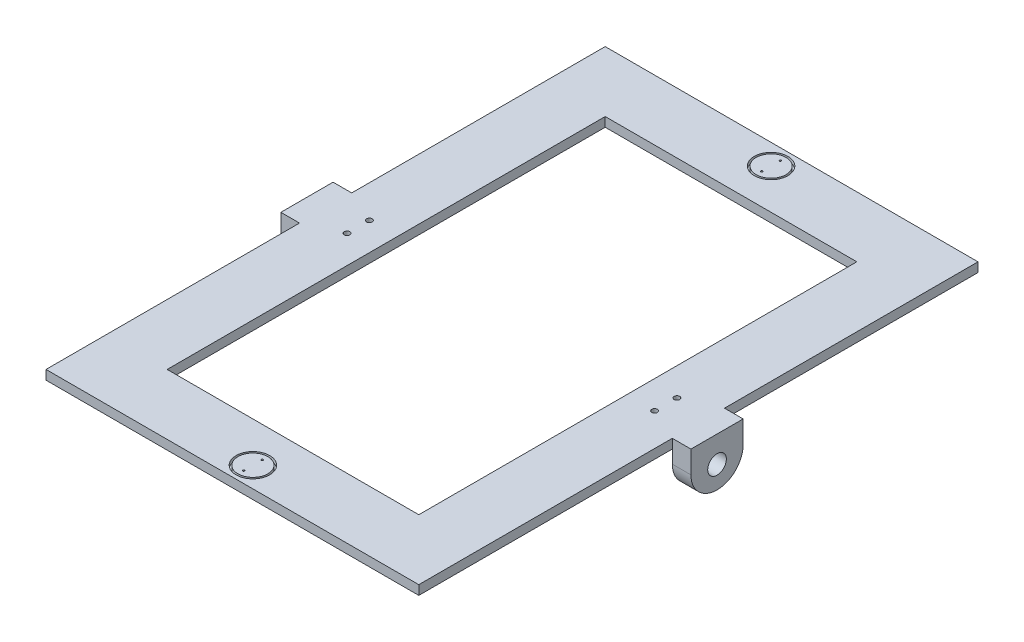
ISO-10303-21;
HEADER;
FILE_DESCRIPTION(('STEP AP214'),'2;1');
FILE_NAME('part.step','',(''),(''),'','','');
FILE_SCHEMA(('AUTOMOTIVE_DESIGN { 1 0 10303 214 1 1 1 1 }'));
ENDSEC;
DATA;
#1=APPLICATION_CONTEXT('core data for automotive mechanical design processes');
#2=APPLICATION_PROTOCOL_DEFINITION('international standard','automotive_design',2000,#1);
#3=PRODUCT_CONTEXT('',#1,'mechanical');
#4=PRODUCT('Part','Part','',(#3));
#5=PRODUCT_RELATED_PRODUCT_CATEGORY('part','',(#4));
#6=PRODUCT_DEFINITION_FORMATION('','',#4);
#7=PRODUCT_DEFINITION_CONTEXT('part definition',#1,'design');
#8=PRODUCT_DEFINITION('design','',#6,#7);
#9=PRODUCT_DEFINITION_SHAPE('','',#8);
#10=(LENGTH_UNIT() NAMED_UNIT(*) SI_UNIT(.MILLI.,.METRE.));
#11=(NAMED_UNIT(*) PLANE_ANGLE_UNIT() SI_UNIT($,.RADIAN.));
#12=(NAMED_UNIT(*) SI_UNIT($,.STERADIAN.) SOLID_ANGLE_UNIT());
#13=UNCERTAINTY_MEASURE_WITH_UNIT(LENGTH_MEASURE(1.E-05),#10,'distance_accuracy_value','');
#14=(GEOMETRIC_REPRESENTATION_CONTEXT(3) GLOBAL_UNCERTAINTY_ASSIGNED_CONTEXT((#13)) GLOBAL_UNIT_ASSIGNED_CONTEXT((#10,
#11,#12)) REPRESENTATION_CONTEXT('',''));
#15=CARTESIAN_POINT('',(0.,0.,0.));
#16=DIRECTION('',(0.,0.,1.));
#17=DIRECTION('',(1.,0.,0.));
#18=AXIS2_PLACEMENT_3D('',#15,#16,#17);
#19=CARTESIAN_POINT('',(-100.,5.,-150.));
#20=DIRECTION('',(1.,0.,0.));
#21=DIRECTION('',(0.,0.,-1.));
#22=AXIS2_PLACEMENT_3D('',#19,#20,#21);
#23=PLANE('',#22);
#24=DIRECTION('',(0.,0.,1.));
#25=VECTOR('',#24,1.);
#26=CARTESIAN_POINT('',(-100.,5.,-150.));
#27=LINE('',#26,#25);
#28=CARTESIAN_POINT('',(-100.,5.,14.));
#29=VERTEX_POINT('',#28);
#30=CARTESIAN_POINT('',(-100.,5.,150.));
#31=VERTEX_POINT('',#30);
#32=EDGE_CURVE('E319',#29,#31,#27,.T.);
#33=ORIENTED_EDGE('',*,*,#32,.F.);
#34=DIRECTION('',(0.,-1.,0.));
#35=VECTOR('',#34,1.);
#36=CARTESIAN_POINT('',(-100.,5.,14.));
#37=LINE('',#36,#35);
#38=CARTESIAN_POINT('',(-100.,0.,14.));
#39=VERTEX_POINT('',#38);
#40=EDGE_CURVE('E177',#29,#39,#37,.T.);
#41=ORIENTED_EDGE('',*,*,#40,.T.);
#42=DIRECTION('',(0.,0.,1.));
#43=VECTOR('',#42,1.);
#44=CARTESIAN_POINT('',(-100.,0.,-150.));
#45=LINE('',#44,#43);
#46=CARTESIAN_POINT('',(-100.,0.,150.));
#47=VERTEX_POINT('',#46);
#48=EDGE_CURVE('E334',#39,#47,#45,.T.);
#49=ORIENTED_EDGE('',*,*,#48,.T.);
#50=DIRECTION('',(0.,-1.,0.));
#51=VECTOR('',#50,1.);
#52=CARTESIAN_POINT('',(-100.,5.,150.));
#53=LINE('',#52,#51);
#54=EDGE_CURVE('E346',#31,#47,#53,.T.);
#55=ORIENTED_EDGE('',*,*,#54,.F.);
#56=EDGE_LOOP('',(#33,#41,#49,#55));
#57=FACE_BOUND('',#56,.T.);
#58=ADVANCED_FACE('F39',(#57),#23,.F.);
#59=CARTESIAN_POINT('',(100.,5.,-150.));
#60=DIRECTION('',(-1.,0.,0.));
#61=DIRECTION('',(0.,0.,1.));
#62=AXIS2_PLACEMENT_3D('',#59,#60,#61);
#63=PLANE('',#62);
#64=DIRECTION('',(0.,-1.,0.));
#65=VECTOR('',#64,1.);
#66=CARTESIAN_POINT('',(100.,5.,14.));
#67=LINE('',#66,#65);
#68=CARTESIAN_POINT('',(100.,5.,14.));
#69=VERTEX_POINT('',#68);
#70=CARTESIAN_POINT('',(100.,0.,14.));
#71=VERTEX_POINT('',#70);
#72=EDGE_CURVE('E65',#69,#71,#67,.T.);
#73=ORIENTED_EDGE('',*,*,#72,.F.);
#74=DIRECTION('',(0.,0.,-1.));
#75=VECTOR('',#74,1.);
#76=CARTESIAN_POINT('',(100.,5.,-150.));
#77=LINE('',#76,#75);
#78=CARTESIAN_POINT('',(100.,5.,150.));
#79=VERTEX_POINT('',#78);
#80=EDGE_CURVE('E312',#79,#69,#77,.T.);
#81=ORIENTED_EDGE('',*,*,#80,.F.);
#82=DIRECTION('',(0.,-1.,0.));
#83=VECTOR('',#82,1.);
#84=CARTESIAN_POINT('',(100.,5.,150.));
#85=LINE('',#84,#83);
#86=CARTESIAN_POINT('',(100.,0.,150.));
#87=VERTEX_POINT('',#86);
#88=EDGE_CURVE('E326',#79,#87,#85,.T.);
#89=ORIENTED_EDGE('',*,*,#88,.T.);
#90=DIRECTION('',(0.,0.,-1.));
#91=VECTOR('',#90,1.);
#92=CARTESIAN_POINT('',(100.,0.,-150.));
#93=LINE('',#92,#91);
#94=EDGE_CURVE('E327',#87,#71,#93,.T.);
#95=ORIENTED_EDGE('',*,*,#94,.T.);
#96=EDGE_LOOP('',(#73,#81,#89,#95));
#97=FACE_BOUND('',#96,.T.);
#98=ADVANCED_FACE('F41',(#97),#63,.F.);
#99=DIRECTION('',(0.,1.,0.));
#100=VECTOR('',#99,1.);
#101=CARTESIAN_POINT('',(100.,5.,-14.));
#102=LINE('',#101,#100);
#103=CARTESIAN_POINT('',(100.,0.,-14.));
#104=VERTEX_POINT('',#103);
#105=CARTESIAN_POINT('',(100.,5.,-14.));
#106=VERTEX_POINT('',#105);
#107=EDGE_CURVE('E49',#104,#106,#102,.T.);
#108=ORIENTED_EDGE('',*,*,#107,.F.);
#109=CARTESIAN_POINT('',(100.,0.,-150.));
#110=VERTEX_POINT('',#109);
#111=EDGE_CURVE('E311',#104,#110,#93,.T.);
#112=ORIENTED_EDGE('',*,*,#111,.T.);
#113=DIRECTION('',(0.,-1.,0.));
#114=VECTOR('',#113,1.);
#115=CARTESIAN_POINT('',(100.,5.,-150.));
#116=LINE('',#115,#114);
#117=CARTESIAN_POINT('',(100.,5.,-150.));
#118=VERTEX_POINT('',#117);
#119=EDGE_CURVE('E43',#118,#110,#116,.T.);
#120=ORIENTED_EDGE('',*,*,#119,.F.);
#121=EDGE_CURVE('E316',#106,#118,#77,.T.);
#122=ORIENTED_EDGE('',*,*,#121,.F.);
#123=EDGE_LOOP('',(#108,#112,#120,#122));
#124=FACE_BOUND('',#123,.T.);
#125=ADVANCED_FACE('F390',(#124),#63,.F.);
#126=CARTESIAN_POINT('',(0.,5.,0.));
#127=DIRECTION('',(0.,1.,0.));
#128=DIRECTION('',(0.,0.,1.));
#129=AXIS2_PLACEMENT_3D('',#126,#127,#128);
#130=PLANE('',#129);
#131=CARTESIAN_POINT('',(82.5,5.,-6.));
#132=DIRECTION('',(0.,-1.,0.));
#133=DIRECTION('',(0.,0.,1.));
#134=AXIS2_PLACEMENT_3D('',#131,#132,#133);
#135=CIRCLE('',#134,1.49999999999995);
#136=CARTESIAN_POINT('',(82.5,5.,-4.50000000000005));
#137=VERTEX_POINT('',#136);
#138=EDGE_CURVE('E565',#137,#137,#135,.T.);
#139=ORIENTED_EDGE('',*,*,#138,.T.);
#140=EDGE_LOOP('',(#139));
#141=FACE_BOUND('',#140,.T.);
#142=CARTESIAN_POINT('',(82.5,5.,5.99999999999998));
#143=DIRECTION('',(0.,-1.,0.));
#144=DIRECTION('',(0.,0.,-1.));
#145=AXIS2_PLACEMENT_3D('',#142,#143,#144);
#146=CIRCLE('',#145,1.49999999999995);
#147=CARTESIAN_POINT('',(82.5,5.,4.50000000000003));
#148=VERTEX_POINT('',#147);
#149=EDGE_CURVE('E574',#148,#148,#146,.T.);
#150=ORIENTED_EDGE('',*,*,#149,.T.);
#151=EDGE_LOOP('',(#150));
#152=FACE_BOUND('',#151,.T.);
#153=CARTESIAN_POINT('',(-82.5,5.,-6.));
#154=DIRECTION('',(0.,1.,0.));
#155=DIRECTION('',(0.,0.,1.));
#156=AXIS2_PLACEMENT_3D('',#153,#154,#155);
#157=CIRCLE('',#156,1.49999999999995);
#158=CARTESIAN_POINT('',(-82.5,5.,-4.50000000000005));
#159=VERTEX_POINT('',#158);
#160=EDGE_CURVE('E580',#159,#159,#157,.T.);
#161=ORIENTED_EDGE('',*,*,#160,.F.);
#162=EDGE_LOOP('',(#161));
#163=FACE_BOUND('',#162,.T.);
#164=CARTESIAN_POINT('',(-82.5,5.,5.99999999999998));
#165=DIRECTION('',(0.,1.,0.));
#166=DIRECTION('',(0.,0.,-1.));
#167=AXIS2_PLACEMENT_3D('',#164,#165,#166);
#168=CIRCLE('',#167,1.49999999999995);
#169=CARTESIAN_POINT('',(-82.5,5.,4.50000000000003));
#170=VERTEX_POINT('',#169);
#171=EDGE_CURVE('E571',#170,#170,#168,.T.);
#172=ORIENTED_EDGE('',*,*,#171,.F.);
#173=EDGE_LOOP('',(#172));
#174=FACE_BOUND('',#173,.T.);
#175=CARTESIAN_POINT('',(0.,5.,-139.));
#176=DIRECTION('',(0.,-1.,0.));
#177=DIRECTION('',(0.,0.,-1.));
#178=AXIS2_PLACEMENT_3D('',#175,#176,#177);
#179=CIRCLE('',#178,9.00000000000001);
#180=CARTESIAN_POINT('',(0.,5.,-148.));
#181=VERTEX_POINT('',#180);
#182=EDGE_CURVE('E632',#181,#181,#179,.T.);
#183=ORIENTED_EDGE('',*,*,#182,.T.);
#184=EDGE_LOOP('',(#183));
#185=FACE_BOUND('',#184,.T.);
#186=CARTESIAN_POINT('',(0.,5.,139.));
#187=DIRECTION('',(0.,1.,0.));
#188=DIRECTION('',(0.,0.,1.));
#189=AXIS2_PLACEMENT_3D('',#186,#187,#188);
#190=CIRCLE('',#189,9.00000000000001);
#191=CARTESIAN_POINT('',(0.,5.,148.));
#192=VERTEX_POINT('',#191);
#193=EDGE_CURVE('E648',#192,#192,#190,.T.);
#194=ORIENTED_EDGE('',*,*,#193,.F.);
#195=EDGE_LOOP('',(#194));
#196=FACE_BOUND('',#195,.T.);
#197=ORIENTED_EDGE('',*,*,#80,.T.);
#198=DIRECTION('',(-1.,0.,0.));
#199=VECTOR('',#198,1.);
#200=CARTESIAN_POINT('',(110.,5.,14.));
#201=LINE('',#200,#199);
#202=CARTESIAN_POINT('',(110.,5.,14.));
#203=VERTEX_POINT('',#202);
#204=EDGE_CURVE('E244',#203,#69,#201,.T.);
#205=ORIENTED_EDGE('',*,*,#204,.F.);
#206=DIRECTION('',(0.,0.,1.));
#207=VECTOR('',#206,1.);
#208=CARTESIAN_POINT('',(110.,5.,14.));
#209=LINE('',#208,#207);
#210=CARTESIAN_POINT('',(110.,5.,-14.));
#211=VERTEX_POINT('',#210);
#212=EDGE_CURVE('E241',#211,#203,#209,.T.);
#213=ORIENTED_EDGE('',*,*,#212,.F.);
#214=DIRECTION('',(-1.,0.,0.));
#215=VECTOR('',#214,1.);
#216=CARTESIAN_POINT('',(110.,5.,-14.));
#217=LINE('',#216,#215);
#218=EDGE_CURVE('E256',#211,#106,#217,.T.);
#219=ORIENTED_EDGE('',*,*,#218,.T.);
#220=ORIENTED_EDGE('',*,*,#121,.T.);
#221=DIRECTION('',(-1.,0.,0.));
#222=VECTOR('',#221,1.);
#223=CARTESIAN_POINT('',(-100.,5.,-150.));
#224=LINE('',#223,#222);
#225=CARTESIAN_POINT('',(-100.,5.,-150.));
#226=VERTEX_POINT('',#225);
#227=EDGE_CURVE('E315',#118,#226,#224,.T.);
#228=ORIENTED_EDGE('',*,*,#227,.T.);
#229=CARTESIAN_POINT('',(-100.,5.,-14.));
#230=VERTEX_POINT('',#229);
#231=EDGE_CURVE('E320',#226,#230,#27,.T.);
#232=ORIENTED_EDGE('',*,*,#231,.T.);
#233=DIRECTION('',(1.,0.,0.));
#234=VECTOR('',#233,1.);
#235=CARTESIAN_POINT('',(-110.,5.,-14.));
#236=LINE('',#235,#234);
#237=CARTESIAN_POINT('',(-110.,5.,-14.));
#238=VERTEX_POINT('',#237);
#239=EDGE_CURVE('E58',#238,#230,#236,.T.);
#240=ORIENTED_EDGE('',*,*,#239,.F.);
#241=DIRECTION('',(0.,0.,1.));
#242=VECTOR('',#241,1.);
#243=CARTESIAN_POINT('',(-110.,5.,14.));
#244=LINE('',#243,#242);
#245=CARTESIAN_POINT('',(-110.,5.,14.));
#246=VERTEX_POINT('',#245);
#247=EDGE_CURVE('E188',#238,#246,#244,.T.);
#248=ORIENTED_EDGE('',*,*,#247,.T.);
#249=DIRECTION('',(1.,0.,0.));
#250=VECTOR('',#249,1.);
#251=CARTESIAN_POINT('',(-110.,5.,14.));
#252=LINE('',#251,#250);
#253=EDGE_CURVE('E169',#246,#29,#252,.T.);
#254=ORIENTED_EDGE('',*,*,#253,.T.);
#255=ORIENTED_EDGE('',*,*,#32,.T.);
#256=DIRECTION('',(1.,0.,0.));
#257=VECTOR('',#256,1.);
#258=CARTESIAN_POINT('',(-100.,5.,150.));
#259=LINE('',#258,#257);
#260=EDGE_CURVE('E323',#31,#79,#259,.T.);
#261=ORIENTED_EDGE('',*,*,#260,.T.);
#262=EDGE_LOOP('',(#197,#205,#213,#219,#220,#228,#232,#240,#248,#254,#255,#261));
#263=FACE_BOUND('',#262,.T.);
#264=DIRECTION('',(-1.,0.,0.));
#265=VECTOR('',#264,1.);
#266=CARTESIAN_POINT('',(-67.5,5.,-117.5));
#267=LINE('',#266,#265);
#268=CARTESIAN_POINT('',(67.5,5.,-117.5));
#269=VERTEX_POINT('',#268);
#270=CARTESIAN_POINT('',(-67.5,5.,-117.5));
#271=VERTEX_POINT('',#270);
#272=EDGE_CURVE('E272',#269,#271,#267,.T.);
#273=ORIENTED_EDGE('',*,*,#272,.F.);
#274=DIRECTION('',(0.,0.,-1.));
#275=VECTOR('',#274,1.);
#276=CARTESIAN_POINT('',(67.5,5.,-117.5));
#277=LINE('',#276,#275);
#278=CARTESIAN_POINT('',(67.5,5.,117.5));
#279=VERTEX_POINT('',#278);
#280=EDGE_CURVE('E269',#279,#269,#277,.T.);
#281=ORIENTED_EDGE('',*,*,#280,.F.);
#282=DIRECTION('',(1.,0.,0.));
#283=VECTOR('',#282,1.);
#284=CARTESIAN_POINT('',(-67.5,5.,117.5));
#285=LINE('',#284,#283);
#286=CARTESIAN_POINT('',(-67.5,5.,117.5));
#287=VERTEX_POINT('',#286);
#288=EDGE_CURVE('E280',#287,#279,#285,.T.);
#289=ORIENTED_EDGE('',*,*,#288,.F.);
#290=DIRECTION('',(0.,0.,1.));
#291=VECTOR('',#290,1.);
#292=CARTESIAN_POINT('',(-67.5,5.,-117.5));
#293=LINE('',#292,#291);
#294=EDGE_CURVE('E276',#271,#287,#293,.T.);
#295=ORIENTED_EDGE('',*,*,#294,.F.);
#296=EDGE_LOOP('',(#273,#281,#289,#295));
#297=FACE_BOUND('',#296,.T.);
#298=ADVANCED_FACE('F194',(#141,#152,#163,#174,#185,#196,#263,#297),#130,.T.);
#299=CARTESIAN_POINT('',(0.,0.,0.));
#300=DIRECTION('',(0.,1.,0.));
#301=DIRECTION('',(0.,0.,1.));
#302=AXIS2_PLACEMENT_3D('',#299,#300,#301);
#303=PLANE('',#302);
#304=CARTESIAN_POINT('',(82.5,0.,-6.));
#305=DIRECTION('',(0.,1.,0.));
#306=DIRECTION('',(0.,0.,1.));
#307=AXIS2_PLACEMENT_3D('',#304,#305,#306);
#308=CIRCLE('',#307,1.49999999999995);
#309=CARTESIAN_POINT('',(82.5,0.,-4.50000000000005));
#310=VERTEX_POINT('',#309);
#311=EDGE_CURVE('E562',#310,#310,#308,.T.);
#312=ORIENTED_EDGE('',*,*,#311,.T.);
#313=EDGE_LOOP('',(#312));
#314=FACE_BOUND('',#313,.T.);
#315=CARTESIAN_POINT('',(82.5,0.,5.99999999999998));
#316=DIRECTION('',(0.,1.,0.));
#317=DIRECTION('',(0.,0.,1.));
#318=AXIS2_PLACEMENT_3D('',#315,#316,#317);
#319=CIRCLE('',#318,1.49999999999995);
#320=CARTESIAN_POINT('',(82.5,0.,7.49999999999993));
#321=VERTEX_POINT('',#320);
#322=EDGE_CURVE('E567',#321,#321,#319,.T.);
#323=ORIENTED_EDGE('',*,*,#322,.T.);
#324=EDGE_LOOP('',(#323));
#325=FACE_BOUND('',#324,.T.);
#326=CARTESIAN_POINT('',(-82.5,0.,-6.));
#327=DIRECTION('',(0.,1.,0.));
#328=DIRECTION('',(0.,0.,1.));
#329=AXIS2_PLACEMENT_3D('',#326,#327,#328);
#330=CIRCLE('',#329,1.49999999999995);
#331=CARTESIAN_POINT('',(-82.5,0.,-4.50000000000005));
#332=VERTEX_POINT('',#331);
#333=EDGE_CURVE('E584',#332,#332,#330,.F.);
#334=ORIENTED_EDGE('',*,*,#333,.F.);
#335=EDGE_LOOP('',(#334));
#336=FACE_BOUND('',#335,.T.);
#337=CARTESIAN_POINT('',(-82.5,0.,5.99999999999998));
#338=DIRECTION('',(0.,1.,0.));
#339=DIRECTION('',(0.,0.,1.));
#340=AXIS2_PLACEMENT_3D('',#337,#338,#339);
#341=CIRCLE('',#340,1.49999999999995);
#342=CARTESIAN_POINT('',(-82.5,0.,7.49999999999993));
#343=VERTEX_POINT('',#342);
#344=EDGE_CURVE('E585',#343,#343,#341,.F.);
#345=ORIENTED_EDGE('',*,*,#344,.F.);
#346=EDGE_LOOP('',(#345));
#347=FACE_BOUND('',#346,.T.);
#348=CARTESIAN_POINT('',(0.,0.,-134.));
#349=DIRECTION('',(0.,1.,0.));
#350=DIRECTION('',(0.,0.,1.));
#351=AXIS2_PLACEMENT_3D('',#348,#349,#350);
#352=CIRCLE('',#351,0.5);
#353=CARTESIAN_POINT('',(0.,0.,-133.5));
#354=VERTEX_POINT('',#353);
#355=EDGE_CURVE('E600',#354,#354,#352,.T.);
#356=ORIENTED_EDGE('',*,*,#355,.T.);
#357=EDGE_LOOP('',(#356));
#358=FACE_BOUND('',#357,.T.);
#359=CARTESIAN_POINT('',(0.,0.,-144.));
#360=DIRECTION('',(0.,1.,0.));
#361=DIRECTION('',(0.,0.,1.));
#362=AXIS2_PLACEMENT_3D('',#359,#360,#361);
#363=CIRCLE('',#362,0.5);
#364=CARTESIAN_POINT('',(0.,0.,-143.5));
#365=VERTEX_POINT('',#364);
#366=EDGE_CURVE('E601',#365,#365,#363,.T.);
#367=ORIENTED_EDGE('',*,*,#366,.T.);
#368=EDGE_LOOP('',(#367));
#369=FACE_BOUND('',#368,.T.);
#370=CARTESIAN_POINT('',(0.,0.,134.));
#371=DIRECTION('',(0.,1.,0.));
#372=DIRECTION('',(0.,0.,1.));
#373=AXIS2_PLACEMENT_3D('',#370,#371,#372);
#374=CIRCLE('',#373,0.5);
#375=CARTESIAN_POINT('',(0.,0.,134.5));
#376=VERTEX_POINT('',#375);
#377=EDGE_CURVE('E616',#376,#376,#374,.F.);
#378=ORIENTED_EDGE('',*,*,#377,.F.);
#379=EDGE_LOOP('',(#378));
#380=FACE_BOUND('',#379,.T.);
#381=CARTESIAN_POINT('',(0.,0.,144.));
#382=DIRECTION('',(0.,1.,0.));
#383=DIRECTION('',(0.,0.,1.));
#384=AXIS2_PLACEMENT_3D('',#381,#382,#383);
#385=CIRCLE('',#384,0.5);
#386=CARTESIAN_POINT('',(0.,0.,144.5));
#387=VERTEX_POINT('',#386);
#388=EDGE_CURVE('E617',#387,#387,#385,.F.);
#389=ORIENTED_EDGE('',*,*,#388,.F.);
#390=EDGE_LOOP('',(#389));
#391=FACE_BOUND('',#390,.T.);
#392=ORIENTED_EDGE('',*,*,#94,.F.);
#393=DIRECTION('',(1.,0.,0.));
#394=VECTOR('',#393,1.);
#395=CARTESIAN_POINT('',(-100.,0.,150.));
#396=LINE('',#395,#394);
#397=EDGE_CURVE('E339',#47,#87,#396,.T.);
#398=ORIENTED_EDGE('',*,*,#397,.F.);
#399=ORIENTED_EDGE('',*,*,#48,.F.);
#400=CARTESIAN_POINT('',(-100.,0.,-14.));
#401=VERTEX_POINT('',#400);
#402=EDGE_CURVE('E340',#401,#39,#45,.T.);
#403=ORIENTED_EDGE('',*,*,#402,.F.);
#404=CARTESIAN_POINT('',(-100.,0.,-150.));
#405=VERTEX_POINT('',#404);
#406=EDGE_CURVE('E335',#405,#401,#45,.T.);
#407=ORIENTED_EDGE('',*,*,#406,.F.);
#408=DIRECTION('',(-1.,0.,0.));
#409=VECTOR('',#408,1.);
#410=CARTESIAN_POINT('',(-100.,0.,-150.));
#411=LINE('',#410,#409);
#412=EDGE_CURVE('E330',#110,#405,#411,.T.);
#413=ORIENTED_EDGE('',*,*,#412,.F.);
#414=ORIENTED_EDGE('',*,*,#111,.F.);
#415=EDGE_CURVE('E331',#71,#104,#93,.T.);
#416=ORIENTED_EDGE('',*,*,#415,.F.);
#417=EDGE_LOOP('',(#392,#398,#399,#403,#407,#413,#414,#416));
#418=FACE_BOUND('',#417,.T.);
#419=DIRECTION('',(0.,0.,-1.));
#420=VECTOR('',#419,1.);
#421=CARTESIAN_POINT('',(67.5,0.,-117.5));
#422=LINE('',#421,#420);
#423=CARTESIAN_POINT('',(67.5,0.,117.5));
#424=VERTEX_POINT('',#423);
#425=CARTESIAN_POINT('',(67.5,0.,-117.5));
#426=VERTEX_POINT('',#425);
#427=EDGE_CURVE('E268',#424,#426,#422,.T.);
#428=ORIENTED_EDGE('',*,*,#427,.T.);
#429=DIRECTION('',(-1.,0.,0.));
#430=VECTOR('',#429,1.);
#431=CARTESIAN_POINT('',(-67.5,0.,-117.5));
#432=LINE('',#431,#430);
#433=CARTESIAN_POINT('',(-67.5,0.,-117.5));
#434=VERTEX_POINT('',#433);
#435=EDGE_CURVE('E287',#426,#434,#432,.T.);
#436=ORIENTED_EDGE('',*,*,#435,.T.);
#437=DIRECTION('',(0.,0.,1.));
#438=VECTOR('',#437,1.);
#439=CARTESIAN_POINT('',(-67.5,0.,-117.5));
#440=LINE('',#439,#438);
#441=CARTESIAN_POINT('',(-67.5,0.,117.5));
#442=VERTEX_POINT('',#441);
#443=EDGE_CURVE('E291',#434,#442,#440,.T.);
#444=ORIENTED_EDGE('',*,*,#443,.T.);
#445=DIRECTION('',(1.,0.,0.));
#446=VECTOR('',#445,1.);
#447=CARTESIAN_POINT('',(-67.5,0.,117.5));
#448=LINE('',#447,#446);
#449=EDGE_CURVE('E273',#442,#424,#448,.T.);
#450=ORIENTED_EDGE('',*,*,#449,.T.);
#451=EDGE_LOOP('',(#428,#436,#444,#450));
#452=FACE_BOUND('',#451,.T.);
#453=ADVANCED_FACE('F391',(#314,#325,#336,#347,#358,#369,#380,#391,#418,#452),#303,.F.);
#454=CARTESIAN_POINT('',(-100.,5.,-150.));
#455=DIRECTION('',(0.,0.,1.));
#456=DIRECTION('',(1.,0.,0.));
#457=AXIS2_PLACEMENT_3D('',#454,#455,#456);
#458=PLANE('',#457);
#459=ORIENTED_EDGE('',*,*,#412,.T.);
#460=DIRECTION('',(0.,-1.,0.));
#461=VECTOR('',#460,1.);
#462=CARTESIAN_POINT('',(-100.,5.,-150.));
#463=LINE('',#462,#461);
#464=EDGE_CURVE('E349',#226,#405,#463,.T.);
#465=ORIENTED_EDGE('',*,*,#464,.F.);
#466=ORIENTED_EDGE('',*,*,#227,.F.);
#467=ORIENTED_EDGE('',*,*,#119,.T.);
#468=EDGE_LOOP('',(#459,#465,#466,#467));
#469=FACE_BOUND('',#468,.T.);
#470=ADVANCED_FACE('F394',(#469),#458,.F.);
#471=ORIENTED_EDGE('',*,*,#406,.T.);
#472=DIRECTION('',(0.,1.,0.));
#473=VECTOR('',#472,1.);
#474=CARTESIAN_POINT('',(-100.,5.,-14.));
#475=LINE('',#474,#473);
#476=EDGE_CURVE('E11',#401,#230,#475,.T.);
#477=ORIENTED_EDGE('',*,*,#476,.T.);
#478=ORIENTED_EDGE('',*,*,#231,.F.);
#479=ORIENTED_EDGE('',*,*,#464,.T.);
#480=EDGE_LOOP('',(#471,#477,#478,#479));
#481=FACE_BOUND('',#480,.T.);
#482=ADVANCED_FACE('F395',(#481),#23,.F.);
#483=CARTESIAN_POINT('',(-100.,5.,150.));
#484=DIRECTION('',(0.,0.,-1.));
#485=DIRECTION('',(-1.,0.,0.));
#486=AXIS2_PLACEMENT_3D('',#483,#484,#485);
#487=PLANE('',#486);
#488=ORIENTED_EDGE('',*,*,#397,.T.);
#489=ORIENTED_EDGE('',*,*,#88,.F.);
#490=ORIENTED_EDGE('',*,*,#260,.F.);
#491=ORIENTED_EDGE('',*,*,#54,.T.);
#492=EDGE_LOOP('',(#488,#489,#490,#491));
#493=FACE_BOUND('',#492,.T.);
#494=ADVANCED_FACE('F409',(#493),#487,.F.);
#495=CARTESIAN_POINT('',(67.5,5.,-117.5));
#496=DIRECTION('',(-1.,0.,0.));
#497=DIRECTION('',(0.,0.,1.));
#498=AXIS2_PLACEMENT_3D('',#495,#496,#497);
#499=PLANE('',#498);
#500=ORIENTED_EDGE('',*,*,#427,.F.);
#501=DIRECTION('',(0.,-1.,0.));
#502=VECTOR('',#501,1.);
#503=CARTESIAN_POINT('',(67.5,5.,117.5));
#504=LINE('',#503,#502);
#505=EDGE_CURVE('E283',#279,#424,#504,.T.);
#506=ORIENTED_EDGE('',*,*,#505,.F.);
#507=ORIENTED_EDGE('',*,*,#280,.T.);
#508=DIRECTION('',(0.,-1.,0.));
#509=VECTOR('',#508,1.);
#510=CARTESIAN_POINT('',(67.5,5.,-117.5));
#511=LINE('',#510,#509);
#512=EDGE_CURVE('E307',#269,#426,#511,.T.);
#513=ORIENTED_EDGE('',*,*,#512,.T.);
#514=EDGE_LOOP('',(#500,#506,#507,#513));
#515=FACE_BOUND('',#514,.T.);
#516=ADVANCED_FACE('F434',(#515),#499,.T.);
#517=CARTESIAN_POINT('',(-67.5,5.,-117.5));
#518=DIRECTION('',(0.,0.,1.));
#519=DIRECTION('',(1.,0.,0.));
#520=AXIS2_PLACEMENT_3D('',#517,#518,#519);
#521=PLANE('',#520);
#522=ORIENTED_EDGE('',*,*,#435,.F.);
#523=ORIENTED_EDGE('',*,*,#512,.F.);
#524=ORIENTED_EDGE('',*,*,#272,.T.);
#525=DIRECTION('',(0.,-1.,0.));
#526=VECTOR('',#525,1.);
#527=CARTESIAN_POINT('',(-67.5,5.,-117.5));
#528=LINE('',#527,#526);
#529=EDGE_CURVE('E304',#271,#434,#528,.T.);
#530=ORIENTED_EDGE('',*,*,#529,.T.);
#531=EDGE_LOOP('',(#522,#523,#524,#530));
#532=FACE_BOUND('',#531,.T.);
#533=ADVANCED_FACE('F452',(#532),#521,.T.);
#534=CARTESIAN_POINT('',(-67.5,5.,-117.5));
#535=DIRECTION('',(1.,0.,0.));
#536=DIRECTION('',(0.,0.,-1.));
#537=AXIS2_PLACEMENT_3D('',#534,#535,#536);
#538=PLANE('',#537);
#539=ORIENTED_EDGE('',*,*,#443,.F.);
#540=ORIENTED_EDGE('',*,*,#529,.F.);
#541=ORIENTED_EDGE('',*,*,#294,.T.);
#542=DIRECTION('',(0.,-1.,0.));
#543=VECTOR('',#542,1.);
#544=CARTESIAN_POINT('',(-67.5,5.,117.5));
#545=LINE('',#544,#543);
#546=EDGE_CURVE('E301',#287,#442,#545,.T.);
#547=ORIENTED_EDGE('',*,*,#546,.T.);
#548=EDGE_LOOP('',(#539,#540,#541,#547));
#549=FACE_BOUND('',#548,.T.);
#550=ADVANCED_FACE('F456',(#549),#538,.T.);
#551=CARTESIAN_POINT('',(-67.5,5.,117.5));
#552=DIRECTION('',(0.,0.,-1.));
#553=DIRECTION('',(-1.,0.,0.));
#554=AXIS2_PLACEMENT_3D('',#551,#552,#553);
#555=PLANE('',#554);
#556=ORIENTED_EDGE('',*,*,#449,.F.);
#557=ORIENTED_EDGE('',*,*,#546,.F.);
#558=ORIENTED_EDGE('',*,*,#288,.T.);
#559=ORIENTED_EDGE('',*,*,#505,.T.);
#560=EDGE_LOOP('',(#556,#557,#558,#559));
#561=FACE_BOUND('',#560,.T.);
#562=ADVANCED_FACE('F460',(#561),#555,.T.);
#563=CARTESIAN_POINT('',(110.,-7.00000120863291,0.));
#564=DIRECTION('',(-1.,0.,0.));
#565=DIRECTION('',(0.,0.,1.));
#566=AXIS2_PLACEMENT_3D('',#563,#564,#565);
#567=PLANE('',#566);
#568=DIRECTION('',(0.,-1.,0.));
#569=VECTOR('',#568,1.);
#570=CARTESIAN_POINT('',(110.,5.,14.));
#571=LINE('',#570,#569);
#572=CARTESIAN_POINT('',(110.,-7.,14.));
#573=VERTEX_POINT('',#572);
#574=EDGE_CURVE('E230',#203,#573,#571,.T.);
#575=ORIENTED_EDGE('',*,*,#574,.T.);
#576=CARTESIAN_POINT('',(110.,-7.00000120863291,0.));
#577=DIRECTION('',(1.,0.,0.));
#578=DIRECTION('',(0.,0.,1.));
#579=AXIS2_PLACEMENT_3D('',#576,#577,#578);
#580=CIRCLE('',#579,14.);
#581=CARTESIAN_POINT('',(110.,-7.,-14.));
#582=VERTEX_POINT('',#581);
#583=EDGE_CURVE('E234',#573,#582,#580,.T.);
#584=ORIENTED_EDGE('',*,*,#583,.T.);
#585=DIRECTION('',(0.,1.,0.));
#586=VECTOR('',#585,1.);
#587=CARTESIAN_POINT('',(110.,5.,-14.));
#588=LINE('',#587,#586);
#589=EDGE_CURVE('E238',#582,#211,#588,.T.);
#590=ORIENTED_EDGE('',*,*,#589,.T.);
#591=ORIENTED_EDGE('',*,*,#212,.T.);
#592=EDGE_LOOP('',(#575,#584,#590,#591));
#593=FACE_BOUND('',#592,.T.);
#594=CARTESIAN_POINT('',(110.,-9.12738819535562,0.));
#595=DIRECTION('',(1.,0.,0.));
#596=DIRECTION('',(0.,0.,-1.));
#597=AXIS2_PLACEMENT_3D('',#594,#595,#596);
#598=CIRCLE('',#597,5.);
#599=CARTESIAN_POINT('',(110.,-9.12738819535562,-5.00000000000001));
#600=VERTEX_POINT('',#599);
#601=EDGE_CURVE('E222',#600,#600,#598,.T.);
#602=ORIENTED_EDGE('',*,*,#601,.F.);
#603=EDGE_LOOP('',(#602));
#604=FACE_BOUND('',#603,.T.);
#605=ADVANCED_FACE('F374',(#593,#604),#567,.F.);
#606=CARTESIAN_POINT('',(100.,-7.00000120863291,0.));
#607=DIRECTION('',(-1.,0.,0.));
#608=DIRECTION('',(0.,0.,1.));
#609=AXIS2_PLACEMENT_3D('',#606,#607,#608);
#610=PLANE('',#609);
#611=CARTESIAN_POINT('',(100.,-7.,14.));
#612=VERTEX_POINT('',#611);
#613=EDGE_CURVE('E226',#71,#612,#67,.T.);
#614=ORIENTED_EDGE('',*,*,#613,.F.);
#615=ORIENTED_EDGE('',*,*,#415,.T.);
#616=CARTESIAN_POINT('',(100.,-7.,-14.));
#617=VERTEX_POINT('',#616);
#618=EDGE_CURVE('E235',#617,#104,#102,.T.);
#619=ORIENTED_EDGE('',*,*,#618,.F.);
#620=CARTESIAN_POINT('',(100.,-7.00000120863291,0.));
#621=DIRECTION('',(1.,0.,0.));
#622=DIRECTION('',(0.,0.,1.));
#623=AXIS2_PLACEMENT_3D('',#620,#621,#622);
#624=CIRCLE('',#623,14.);
#625=EDGE_CURVE('E247',#612,#617,#624,.T.);
#626=ORIENTED_EDGE('',*,*,#625,.F.);
#627=EDGE_LOOP('',(#614,#615,#619,#626));
#628=FACE_BOUND('',#627,.T.);
#629=CARTESIAN_POINT('',(100.,-9.12738819535562,0.));
#630=DIRECTION('',(1.,0.,0.));
#631=DIRECTION('',(0.,0.,-1.));
#632=AXIS2_PLACEMENT_3D('',#629,#630,#631);
#633=CIRCLE('',#632,5.);
#634=CARTESIAN_POINT('',(100.,-9.12738819535562,-5.00000000000001));
#635=VERTEX_POINT('',#634);
#636=EDGE_CURVE('E182',#635,#635,#633,.T.);
#637=ORIENTED_EDGE('',*,*,#636,.T.);
#638=EDGE_LOOP('',(#637));
#639=FACE_BOUND('',#638,.T.);
#640=ADVANCED_FACE('F383',(#628,#639),#610,.T.);
#641=CARTESIAN_POINT('',(110.,5.,14.));
#642=DIRECTION('',(0.,0.,-1.));
#643=DIRECTION('',(0.,1.,0.));
#644=AXIS2_PLACEMENT_3D('',#641,#642,#643);
#645=PLANE('',#644);
#646=ORIENTED_EDGE('',*,*,#72,.T.);
#647=ORIENTED_EDGE('',*,*,#613,.T.);
#648=DIRECTION('',(-1.,0.,0.));
#649=VECTOR('',#648,1.);
#650=CARTESIAN_POINT('',(110.,-7.,14.));
#651=LINE('',#650,#649);
#652=EDGE_CURVE('E264',#573,#612,#651,.T.);
#653=ORIENTED_EDGE('',*,*,#652,.F.);
#654=ORIENTED_EDGE('',*,*,#574,.F.);
#655=ORIENTED_EDGE('',*,*,#204,.T.);
#656=EDGE_LOOP('',(#646,#647,#653,#654,#655));
#657=FACE_BOUND('',#656,.T.);
#658=ADVANCED_FACE('F412',(#657),#645,.F.);
#659=CARTESIAN_POINT('',(110.,-7.00000120863291,0.));
#660=DIRECTION('',(-1.,0.,0.));
#661=DIRECTION('',(0.,0.,1.));
#662=AXIS2_PLACEMENT_3D('',#659,#660,#661);
#663=CYLINDRICAL_SURFACE('',#662,14.);
#664=ORIENTED_EDGE('',*,*,#625,.T.);
#665=DIRECTION('',(-1.,0.,0.));
#666=VECTOR('',#665,1.);
#667=CARTESIAN_POINT('',(110.,-7.,-14.));
#668=LINE('',#667,#666);
#669=EDGE_CURVE('E260',#582,#617,#668,.T.);
#670=ORIENTED_EDGE('',*,*,#669,.F.);
#671=ORIENTED_EDGE('',*,*,#583,.F.);
#672=ORIENTED_EDGE('',*,*,#652,.T.);
#673=EDGE_LOOP('',(#664,#670,#671,#672));
#674=FACE_BOUND('',#673,.T.);
#675=ADVANCED_FACE('F413',(#674),#663,.T.);
#676=CARTESIAN_POINT('',(110.,5.,-14.));
#677=DIRECTION('',(0.,0.,1.));
#678=DIRECTION('',(1.,0.,0.));
#679=AXIS2_PLACEMENT_3D('',#676,#677,#678);
#680=PLANE('',#679);
#681=ORIENTED_EDGE('',*,*,#618,.T.);
#682=ORIENTED_EDGE('',*,*,#107,.T.);
#683=ORIENTED_EDGE('',*,*,#218,.F.);
#684=ORIENTED_EDGE('',*,*,#589,.F.);
#685=ORIENTED_EDGE('',*,*,#669,.T.);
#686=EDGE_LOOP('',(#681,#682,#683,#684,#685));
#687=FACE_BOUND('',#686,.T.);
#688=ADVANCED_FACE('F365',(#687),#680,.F.);
#689=CARTESIAN_POINT('',(110.,-9.12738819535562,0.));
#690=DIRECTION('',(-1.,0.,0.));
#691=DIRECTION('',(0.,0.,1.));
#692=AXIS2_PLACEMENT_3D('',#689,#690,#691);
#693=CYLINDRICAL_SURFACE('',#692,5.);
#694=ORIENTED_EDGE('',*,*,#601,.T.);
#695=EDGE_LOOP('',(#694));
#696=FACE_BOUND('',#695,.T.);
#697=ORIENTED_EDGE('',*,*,#636,.F.);
#698=EDGE_LOOP('',(#697));
#699=FACE_BOUND('',#698,.T.);
#700=ADVANCED_FACE('F420',(#696,#699),#693,.F.);
#701=CARTESIAN_POINT('',(-110.,5.,14.));
#702=DIRECTION('',(0.,0.,1.));
#703=DIRECTION('',(0.,-1.,0.));
#704=AXIS2_PLACEMENT_3D('',#701,#702,#703);
#705=PLANE('',#704);
#706=ORIENTED_EDGE('',*,*,#40,.F.);
#707=ORIENTED_EDGE('',*,*,#253,.F.);
#708=DIRECTION('',(0.,-1.,0.));
#709=VECTOR('',#708,1.);
#710=CARTESIAN_POINT('',(-110.,5.,14.));
#711=LINE('',#710,#709);
#712=CARTESIAN_POINT('',(-110.,-7.,14.));
#713=VERTEX_POINT('',#712);
#714=EDGE_CURVE('E173',#246,#713,#711,.T.);
#715=ORIENTED_EDGE('',*,*,#714,.T.);
#716=DIRECTION('',(1.,0.,0.));
#717=VECTOR('',#716,1.);
#718=CARTESIAN_POINT('',(-110.,-7.,14.));
#719=LINE('',#718,#717);
#720=CARTESIAN_POINT('',(-100.,-7.,14.));
#721=VERTEX_POINT('',#720);
#722=EDGE_CURVE('E206',#713,#721,#719,.T.);
#723=ORIENTED_EDGE('',*,*,#722,.T.);
#724=EDGE_CURVE('E208',#39,#721,#37,.T.);
#725=ORIENTED_EDGE('',*,*,#724,.F.);
#726=EDGE_LOOP('',(#706,#707,#715,#723,#725));
#727=FACE_BOUND('',#726,.T.);
#728=ADVANCED_FACE('F171',(#727),#705,.T.);
#729=CARTESIAN_POINT('',(-110.,5.,-14.));
#730=DIRECTION('',(0.,0.,-1.));
#731=DIRECTION('',(-1.,0.,0.));
#732=AXIS2_PLACEMENT_3D('',#729,#730,#731);
#733=PLANE('',#732);
#734=CARTESIAN_POINT('',(-100.,-7.,-14.));
#735=VERTEX_POINT('',#734);
#736=EDGE_CURVE('E51',#735,#401,#475,.T.);
#737=ORIENTED_EDGE('',*,*,#736,.F.);
#738=DIRECTION('',(1.,0.,0.));
#739=VECTOR('',#738,1.);
#740=CARTESIAN_POINT('',(-110.,-7.,-14.));
#741=LINE('',#740,#739);
#742=CARTESIAN_POINT('',(-110.,-7.,-14.));
#743=VERTEX_POINT('',#742);
#744=EDGE_CURVE('E217',#743,#735,#741,.T.);
#745=ORIENTED_EDGE('',*,*,#744,.F.);
#746=DIRECTION('',(0.,1.,0.));
#747=VECTOR('',#746,1.);
#748=CARTESIAN_POINT('',(-110.,5.,-14.));
#749=LINE('',#748,#747);
#750=EDGE_CURVE('E198',#743,#238,#749,.T.);
#751=ORIENTED_EDGE('',*,*,#750,.T.);
#752=ORIENTED_EDGE('',*,*,#239,.T.);
#753=ORIENTED_EDGE('',*,*,#476,.F.);
#754=EDGE_LOOP('',(#737,#745,#751,#752,#753));
#755=FACE_BOUND('',#754,.T.);
#756=ADVANCED_FACE('F397',(#755),#733,.T.);
#757=CARTESIAN_POINT('',(-110.,-7.00000120863291,0.));
#758=DIRECTION('',(1.,0.,0.));
#759=DIRECTION('',(0.,0.,-1.));
#760=AXIS2_PLACEMENT_3D('',#757,#758,#759);
#761=CYLINDRICAL_SURFACE('',#760,14.);
#762=CARTESIAN_POINT('',(-100.,-7.00000120863291,0.));
#763=DIRECTION('',(1.,0.,0.));
#764=DIRECTION('',(0.,0.,1.));
#765=AXIS2_PLACEMENT_3D('',#762,#763,#764);
#766=CIRCLE('',#765,14.);
#767=EDGE_CURVE('E192',#721,#735,#766,.T.);
#768=ORIENTED_EDGE('',*,*,#767,.F.);
#769=ORIENTED_EDGE('',*,*,#722,.F.);
#770=CARTESIAN_POINT('',(-110.,-7.00000120863291,0.));
#771=DIRECTION('',(1.,0.,0.));
#772=DIRECTION('',(0.,0.,1.));
#773=AXIS2_PLACEMENT_3D('',#770,#771,#772);
#774=CIRCLE('',#773,14.);
#775=EDGE_CURVE('E190',#713,#743,#774,.T.);
#776=ORIENTED_EDGE('',*,*,#775,.T.);
#777=ORIENTED_EDGE('',*,*,#744,.T.);
#778=EDGE_LOOP('',(#768,#769,#776,#777));
#779=FACE_BOUND('',#778,.T.);
#780=ADVANCED_FACE('F489',(#779),#761,.T.);
#781=CARTESIAN_POINT('',(-110.,-7.00000120863291,0.));
#782=DIRECTION('',(1.,0.,0.));
#783=DIRECTION('',(0.,0.,1.));
#784=AXIS2_PLACEMENT_3D('',#781,#782,#783);
#785=PLANE('',#784);
#786=CARTESIAN_POINT('',(-110.,-9.12738819535562,0.));
#787=DIRECTION('',(1.,0.,0.));
#788=DIRECTION('',(0.,0.,-1.));
#789=AXIS2_PLACEMENT_3D('',#786,#787,#788);
#790=CIRCLE('',#789,5.);
#791=CARTESIAN_POINT('',(-110.,-9.12738819535562,-5.00000000000001));
#792=VERTEX_POINT('',#791);
#793=EDGE_CURVE('E660',#792,#792,#790,.T.);
#794=ORIENTED_EDGE('',*,*,#793,.T.);
#795=EDGE_LOOP('',(#794));
#796=FACE_BOUND('',#795,.T.);
#797=ORIENTED_EDGE('',*,*,#714,.F.);
#798=ORIENTED_EDGE('',*,*,#247,.F.);
#799=ORIENTED_EDGE('',*,*,#750,.F.);
#800=ORIENTED_EDGE('',*,*,#775,.F.);
#801=EDGE_LOOP('',(#797,#798,#799,#800));
#802=FACE_BOUND('',#801,.T.);
#803=ADVANCED_FACE('F186',(#796,#802),#785,.F.);
#804=CARTESIAN_POINT('',(-100.,-7.00000120863291,0.));
#805=DIRECTION('',(1.,0.,0.));
#806=DIRECTION('',(0.,0.,1.));
#807=AXIS2_PLACEMENT_3D('',#804,#805,#806);
#808=PLANE('',#807);
#809=CARTESIAN_POINT('',(-100.,-9.12738819535562,0.));
#810=DIRECTION('',(1.,0.,0.));
#811=DIRECTION('',(0.,0.,-1.));
#812=AXIS2_PLACEMENT_3D('',#809,#810,#811);
#813=CIRCLE('',#812,5.);
#814=CARTESIAN_POINT('',(-100.,-9.12738819535562,-5.00000000000001));
#815=VERTEX_POINT('',#814);
#816=EDGE_CURVE('E656',#815,#815,#813,.T.);
#817=ORIENTED_EDGE('',*,*,#816,.F.);
#818=EDGE_LOOP('',(#817));
#819=FACE_BOUND('',#818,.T.);
#820=ORIENTED_EDGE('',*,*,#736,.T.);
#821=ORIENTED_EDGE('',*,*,#402,.T.);
#822=ORIENTED_EDGE('',*,*,#724,.T.);
#823=ORIENTED_EDGE('',*,*,#767,.T.);
#824=EDGE_LOOP('',(#820,#821,#822,#823));
#825=FACE_BOUND('',#824,.T.);
#826=ADVANCED_FACE('F399',(#819,#825),#808,.T.);
#827=CARTESIAN_POINT('',(-110.,-9.12738819535562,0.));
#828=DIRECTION('',(1.,0.,0.));
#829=DIRECTION('',(0.,0.,-1.));
#830=AXIS2_PLACEMENT_3D('',#827,#828,#829);
#831=CYLINDRICAL_SURFACE('',#830,5.);
#832=ORIENTED_EDGE('',*,*,#793,.F.);
#833=EDGE_LOOP('',(#832));
#834=FACE_BOUND('',#833,.T.);
#835=ORIENTED_EDGE('',*,*,#816,.T.);
#836=EDGE_LOOP('',(#835));
#837=FACE_BOUND('',#836,.T.);
#838=ADVANCED_FACE('F495',(#834,#837),#831,.F.);
#839=CARTESIAN_POINT('',(0.,3.,139.));
#840=DIRECTION('',(0.,1.,0.));
#841=DIRECTION('',(0.,0.,1.));
#842=AXIS2_PLACEMENT_3D('',#839,#840,#841);
#843=CYLINDRICAL_SURFACE('',#842,9.00000000000001);
#844=CARTESIAN_POINT('',(0.,3.,139.));
#845=DIRECTION('',(0.,1.,0.));
#846=DIRECTION('',(0.,0.,1.));
#847=AXIS2_PLACEMENT_3D('',#844,#845,#846);
#848=CIRCLE('',#847,9.00000000000001);
#849=CARTESIAN_POINT('',(0.,3.,148.));
#850=VERTEX_POINT('',#849);
#851=EDGE_CURVE('E652',#850,#850,#848,.T.);
#852=ORIENTED_EDGE('',*,*,#851,.F.);
#853=EDGE_LOOP('',(#852));
#854=FACE_BOUND('',#853,.T.);
#855=ORIENTED_EDGE('',*,*,#193,.T.);
#856=EDGE_LOOP('',(#855));
#857=FACE_BOUND('',#856,.T.);
#858=ADVANCED_FACE('F502',(#854,#857),#843,.F.);
#859=CARTESIAN_POINT('',(0.,3.,139.));
#860=DIRECTION('',(0.,1.,0.));
#861=DIRECTION('',(0.,0.,1.));
#862=AXIS2_PLACEMENT_3D('',#859,#860,#861);
#863=PLANE('',#862);
#864=CARTESIAN_POINT('',(0.,3.,139.));
#865=DIRECTION('',(0.,1.,0.));
#866=DIRECTION('',(0.,0.,1.));
#867=AXIS2_PLACEMENT_3D('',#864,#865,#866);
#868=CIRCLE('',#867,8.00000000000001);
#869=CARTESIAN_POINT('',(0.,3.,147.));
#870=VERTEX_POINT('',#869);
#871=EDGE_CURVE('E644',#870,#870,#868,.T.);
#872=ORIENTED_EDGE('',*,*,#871,.F.);
#873=EDGE_LOOP('',(#872));
#874=FACE_BOUND('',#873,.T.);
#875=ORIENTED_EDGE('',*,*,#851,.T.);
#876=EDGE_LOOP('',(#875));
#877=FACE_BOUND('',#876,.T.);
#878=ADVANCED_FACE('F506',(#874,#877),#863,.T.);
#879=CARTESIAN_POINT('',(0.,3.,139.));
#880=DIRECTION('',(0.,1.,0.));
#881=DIRECTION('',(0.,0.,1.));
#882=AXIS2_PLACEMENT_3D('',#879,#880,#881);
#883=CYLINDRICAL_SURFACE('',#882,8.00000000000001);
#884=ORIENTED_EDGE('',*,*,#871,.T.);
#885=EDGE_LOOP('',(#884));
#886=FACE_BOUND('',#885,.T.);
#887=CARTESIAN_POINT('',(0.,5.,139.));
#888=DIRECTION('',(0.,1.,0.));
#889=DIRECTION('',(0.,0.,1.));
#890=AXIS2_PLACEMENT_3D('',#887,#888,#889);
#891=CIRCLE('',#890,8.00000000000001);
#892=CARTESIAN_POINT('',(0.,5.,147.));
#893=VERTEX_POINT('',#892);
#894=EDGE_CURVE('E640',#893,#893,#891,.T.);
#895=ORIENTED_EDGE('',*,*,#894,.F.);
#896=EDGE_LOOP('',(#895));
#897=FACE_BOUND('',#896,.T.);
#898=ADVANCED_FACE('F510',(#886,#897),#883,.T.);
#899=CARTESIAN_POINT('',(0.,5.,134.));
#900=DIRECTION('',(0.,1.,0.));
#901=DIRECTION('',(0.,0.,1.));
#902=AXIS2_PLACEMENT_3D('',#899,#900,#901);
#903=CIRCLE('',#902,0.5);
#904=CARTESIAN_POINT('',(0.,5.,134.5));
#905=VERTEX_POINT('',#904);
#906=EDGE_CURVE('E612',#905,#905,#903,.T.);
#907=ORIENTED_EDGE('',*,*,#906,.F.);
#908=EDGE_LOOP('',(#907));
#909=FACE_BOUND('',#908,.T.);
#910=CARTESIAN_POINT('',(0.,5.,144.));
#911=DIRECTION('',(0.,1.,0.));
#912=DIRECTION('',(0.,0.,1.));
#913=AXIS2_PLACEMENT_3D('',#910,#911,#912);
#914=CIRCLE('',#913,0.5);
#915=CARTESIAN_POINT('',(0.,5.,144.5));
#916=VERTEX_POINT('',#915);
#917=EDGE_CURVE('E605',#916,#916,#914,.T.);
#918=ORIENTED_EDGE('',*,*,#917,.F.);
#919=EDGE_LOOP('',(#918));
#920=FACE_BOUND('',#919,.T.);
#921=ORIENTED_EDGE('',*,*,#894,.T.);
#922=EDGE_LOOP('',(#921));
#923=FACE_BOUND('',#922,.T.);
#924=ADVANCED_FACE('F446',(#909,#920,#923),#130,.T.);
#925=CARTESIAN_POINT('',(0.,3.,-139.));
#926=DIRECTION('',(0.,1.,0.));
#927=DIRECTION('',(0.,0.,-1.));
#928=AXIS2_PLACEMENT_3D('',#925,#926,#927);
#929=PLANE('',#928);
#930=CARTESIAN_POINT('',(0.,3.,-139.));
#931=DIRECTION('',(0.,-1.,0.));
#932=DIRECTION('',(0.,0.,-1.));
#933=AXIS2_PLACEMENT_3D('',#930,#931,#932);
#934=CIRCLE('',#933,9.00000000000001);
#935=CARTESIAN_POINT('',(0.,3.,-148.));
#936=VERTEX_POINT('',#935);
#937=EDGE_CURVE('E636',#936,#936,#934,.T.);
#938=ORIENTED_EDGE('',*,*,#937,.F.);
#939=EDGE_LOOP('',(#938));
#940=FACE_BOUND('',#939,.T.);
#941=CARTESIAN_POINT('',(0.,3.,-139.));
#942=DIRECTION('',(0.,-1.,0.));
#943=DIRECTION('',(0.,0.,-1.));
#944=AXIS2_PLACEMENT_3D('',#941,#942,#943);
#945=CIRCLE('',#944,8.00000000000001);
#946=CARTESIAN_POINT('',(0.,3.,-147.));
#947=VERTEX_POINT('',#946);
#948=EDGE_CURVE('E628',#947,#947,#945,.T.);
#949=ORIENTED_EDGE('',*,*,#948,.T.);
#950=EDGE_LOOP('',(#949));
#951=FACE_BOUND('',#950,.T.);
#952=ADVANCED_FACE('F519',(#940,#951),#929,.T.);
#953=CARTESIAN_POINT('',(0.,3.,-139.));
#954=DIRECTION('',(0.,1.,0.));
#955=DIRECTION('',(0.,0.,1.));
#956=AXIS2_PLACEMENT_3D('',#953,#954,#955);
#957=CYLINDRICAL_SURFACE('',#956,9.00000000000001);
#958=ORIENTED_EDGE('',*,*,#937,.T.);
#959=EDGE_LOOP('',(#958));
#960=FACE_BOUND('',#959,.T.);
#961=ORIENTED_EDGE('',*,*,#182,.F.);
#962=EDGE_LOOP('',(#961));
#963=FACE_BOUND('',#962,.T.);
#964=ADVANCED_FACE('F515',(#960,#963),#957,.F.);
#965=CARTESIAN_POINT('',(0.,3.,-139.));
#966=DIRECTION('',(0.,1.,0.));
#967=DIRECTION('',(0.,0.,1.));
#968=AXIS2_PLACEMENT_3D('',#965,#966,#967);
#969=CYLINDRICAL_SURFACE('',#968,8.00000000000001);
#970=ORIENTED_EDGE('',*,*,#948,.F.);
#971=EDGE_LOOP('',(#970));
#972=FACE_BOUND('',#971,.T.);
#973=CARTESIAN_POINT('',(0.,5.,-139.));
#974=DIRECTION('',(0.,-1.,0.));
#975=DIRECTION('',(0.,0.,-1.));
#976=AXIS2_PLACEMENT_3D('',#973,#974,#975);
#977=CIRCLE('',#976,8.00000000000001);
#978=CARTESIAN_POINT('',(0.,5.,-147.));
#979=VERTEX_POINT('',#978);
#980=EDGE_CURVE('E621',#979,#979,#977,.T.);
#981=ORIENTED_EDGE('',*,*,#980,.T.);
#982=EDGE_LOOP('',(#981));
#983=FACE_BOUND('',#982,.T.);
#984=ADVANCED_FACE('F518',(#972,#983),#969,.T.);
#985=CARTESIAN_POINT('',(0.,5.,-134.));
#986=DIRECTION('',(0.,-1.,0.));
#987=DIRECTION('',(0.,0.,-1.));
#988=AXIS2_PLACEMENT_3D('',#985,#986,#987);
#989=CIRCLE('',#988,0.5);
#990=CARTESIAN_POINT('',(0.,5.,-134.5));
#991=VERTEX_POINT('',#990);
#992=EDGE_CURVE('E596',#991,#991,#989,.T.);
#993=ORIENTED_EDGE('',*,*,#992,.T.);
#994=EDGE_LOOP('',(#993));
#995=FACE_BOUND('',#994,.T.);
#996=CARTESIAN_POINT('',(0.,5.,-144.));
#997=DIRECTION('',(0.,-1.,0.));
#998=DIRECTION('',(0.,0.,-1.));
#999=AXIS2_PLACEMENT_3D('',#996,#997,#998);
#1000=CIRCLE('',#999,0.5);
#1001=CARTESIAN_POINT('',(0.,5.,-144.5));
#1002=VERTEX_POINT('',#1001);
#1003=EDGE_CURVE('E589',#1002,#1002,#1000,.T.);
#1004=ORIENTED_EDGE('',*,*,#1003,.T.);
#1005=EDGE_LOOP('',(#1004));
#1006=FACE_BOUND('',#1005,.T.);
#1007=ORIENTED_EDGE('',*,*,#980,.F.);
#1008=EDGE_LOOP('',(#1007));
#1009=FACE_BOUND('',#1008,.T.);
#1010=ADVANCED_FACE('F445',(#995,#1006,#1009),#130,.T.);
#1011=CARTESIAN_POINT('',(0.,-1.4142135623731,144.));
#1012=DIRECTION('',(0.,1.,0.));
#1013=DIRECTION('',(0.,0.,1.));
#1014=AXIS2_PLACEMENT_3D('',#1011,#1012,#1013);
#1015=CYLINDRICAL_SURFACE('',#1014,0.5);
#1016=ORIENTED_EDGE('',*,*,#388,.T.);
#1017=EDGE_LOOP('',(#1016));
#1018=FACE_BOUND('',#1017,.T.);
#1019=ORIENTED_EDGE('',*,*,#917,.T.);
#1020=EDGE_LOOP('',(#1019));
#1021=FACE_BOUND('',#1020,.T.);
#1022=ADVANCED_FACE('F527',(#1018,#1021),#1015,.F.);
#1023=CARTESIAN_POINT('',(0.,-1.4142135623731,134.));
#1024=DIRECTION('',(0.,1.,0.));
#1025=DIRECTION('',(0.,0.,1.));
#1026=AXIS2_PLACEMENT_3D('',#1023,#1024,#1025);
#1027=CYLINDRICAL_SURFACE('',#1026,0.5);
#1028=ORIENTED_EDGE('',*,*,#377,.T.);
#1029=EDGE_LOOP('',(#1028));
#1030=FACE_BOUND('',#1029,.T.);
#1031=ORIENTED_EDGE('',*,*,#906,.T.);
#1032=EDGE_LOOP('',(#1031));
#1033=FACE_BOUND('',#1032,.T.);
#1034=ADVANCED_FACE('F530',(#1030,#1033),#1027,.F.);
#1035=CARTESIAN_POINT('',(0.,-1.4142135623731,-144.));
#1036=DIRECTION('',(0.,1.,0.));
#1037=DIRECTION('',(0.,0.,1.));
#1038=AXIS2_PLACEMENT_3D('',#1035,#1036,#1037);
#1039=CYLINDRICAL_SURFACE('',#1038,0.5);
#1040=ORIENTED_EDGE('',*,*,#366,.F.);
#1041=EDGE_LOOP('',(#1040));
#1042=FACE_BOUND('',#1041,.T.);
#1043=ORIENTED_EDGE('',*,*,#1003,.F.);
#1044=EDGE_LOOP('',(#1043));
#1045=FACE_BOUND('',#1044,.T.);
#1046=ADVANCED_FACE('F534',(#1042,#1045),#1039,.F.);
#1047=CARTESIAN_POINT('',(0.,-1.4142135623731,-134.));
#1048=DIRECTION('',(0.,1.,0.));
#1049=DIRECTION('',(0.,0.,1.));
#1050=AXIS2_PLACEMENT_3D('',#1047,#1048,#1049);
#1051=CYLINDRICAL_SURFACE('',#1050,0.5);
#1052=ORIENTED_EDGE('',*,*,#355,.F.);
#1053=EDGE_LOOP('',(#1052));
#1054=FACE_BOUND('',#1053,.T.);
#1055=ORIENTED_EDGE('',*,*,#992,.F.);
#1056=EDGE_LOOP('',(#1055));
#1057=FACE_BOUND('',#1056,.T.);
#1058=ADVANCED_FACE('F538',(#1054,#1057),#1051,.F.);
#1059=CARTESIAN_POINT('',(-82.5,-4.24264068711916,5.99999999999998));
#1060=DIRECTION('',(0.,1.,0.));
#1061=DIRECTION('',(0.,0.,1.));
#1062=AXIS2_PLACEMENT_3D('',#1059,#1060,#1061);
#1063=CYLINDRICAL_SURFACE('',#1062,1.49999999999995);
#1064=ORIENTED_EDGE('',*,*,#344,.T.);
#1065=EDGE_LOOP('',(#1064));
#1066=FACE_BOUND('',#1065,.T.);
#1067=ORIENTED_EDGE('',*,*,#171,.T.);
#1068=EDGE_LOOP('',(#1067));
#1069=FACE_BOUND('',#1068,.T.);
#1070=ADVANCED_FACE('F542',(#1066,#1069),#1063,.F.);
#1071=CARTESIAN_POINT('',(-82.5,-4.24264068711916,-6.));
#1072=DIRECTION('',(0.,1.,0.));
#1073=DIRECTION('',(0.,0.,1.));
#1074=AXIS2_PLACEMENT_3D('',#1071,#1072,#1073);
#1075=CYLINDRICAL_SURFACE('',#1074,1.49999999999995);
#1076=ORIENTED_EDGE('',*,*,#333,.T.);
#1077=EDGE_LOOP('',(#1076));
#1078=FACE_BOUND('',#1077,.T.);
#1079=ORIENTED_EDGE('',*,*,#160,.T.);
#1080=EDGE_LOOP('',(#1079));
#1081=FACE_BOUND('',#1080,.T.);
#1082=ADVANCED_FACE('F546',(#1078,#1081),#1075,.F.);
#1083=CARTESIAN_POINT('',(82.5,-4.24264068711916,5.99999999999998));
#1084=DIRECTION('',(0.,1.,0.));
#1085=DIRECTION('',(0.,0.,1.));
#1086=AXIS2_PLACEMENT_3D('',#1083,#1084,#1085);
#1087=CYLINDRICAL_SURFACE('',#1086,1.49999999999995);
#1088=ORIENTED_EDGE('',*,*,#322,.F.);
#1089=EDGE_LOOP('',(#1088));
#1090=FACE_BOUND('',#1089,.T.);
#1091=ORIENTED_EDGE('',*,*,#149,.F.);
#1092=EDGE_LOOP('',(#1091));
#1093=FACE_BOUND('',#1092,.T.);
#1094=ADVANCED_FACE('F550',(#1090,#1093),#1087,.F.);
#1095=CARTESIAN_POINT('',(82.5,-4.24264068711916,-6.));
#1096=DIRECTION('',(0.,1.,0.));
#1097=DIRECTION('',(0.,0.,1.));
#1098=AXIS2_PLACEMENT_3D('',#1095,#1096,#1097);
#1099=CYLINDRICAL_SURFACE('',#1098,1.49999999999995);
#1100=ORIENTED_EDGE('',*,*,#311,.F.);
#1101=EDGE_LOOP('',(#1100));
#1102=FACE_BOUND('',#1101,.T.);
#1103=ORIENTED_EDGE('',*,*,#138,.F.);
#1104=EDGE_LOOP('',(#1103));
#1105=FACE_BOUND('',#1104,.T.);
#1106=ADVANCED_FACE('F554',(#1102,#1105),#1099,.F.);
#1107=CLOSED_SHELL('',(#58,#98,#125,#298,#453,#470,#482,#494,#516,#533,#550,#562,#605,#640,#658,
#675,#688,#700,#728,#756,#780,#803,#826,#838,#858,#878,#898,#924,#952,#964,#984,#1010,#1022,
#1034,#1046,#1058,#1070,#1082,#1094,#1106));
#1108=MANIFOLD_SOLID_BREP('B2',#1107);
#1109=ADVANCED_BREP_SHAPE_REPRESENTATION('',(#18,#1108),#14);
#1110=SHAPE_DEFINITION_REPRESENTATION(#9,#1109);
ENDSEC;
END-ISO-10303-21;
